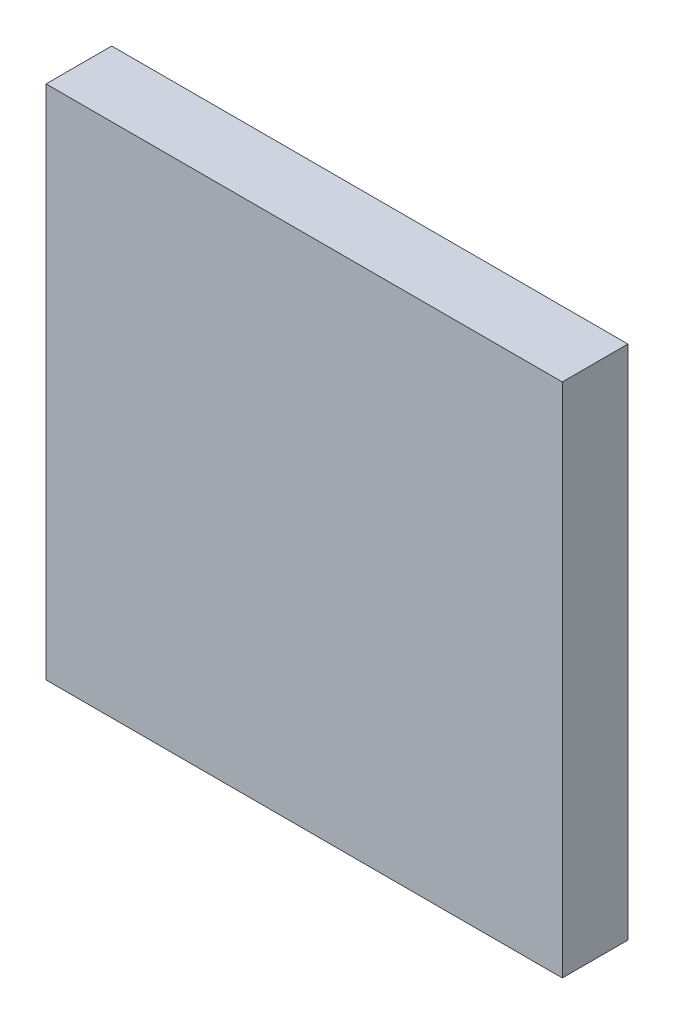
ISO-10303-21;
HEADER;
FILE_DESCRIPTION(('STEP AP214'),'2;1');
FILE_NAME('part.step','',(''),(''),'','','');
FILE_SCHEMA(('AUTOMOTIVE_DESIGN { 1 0 10303 214 1 1 1 1 }'));
ENDSEC;
DATA;
#1=APPLICATION_CONTEXT('core data for automotive mechanical design processes');
#2=APPLICATION_PROTOCOL_DEFINITION('international standard','automotive_design',2000,#1);
#3=PRODUCT_CONTEXT('',#1,'mechanical');
#4=PRODUCT('Part','Part','',(#3));
#5=PRODUCT_RELATED_PRODUCT_CATEGORY('part','',(#4));
#6=PRODUCT_DEFINITION_FORMATION('','',#4);
#7=PRODUCT_DEFINITION_CONTEXT('part definition',#1,'design');
#8=PRODUCT_DEFINITION('design','',#6,#7);
#9=PRODUCT_DEFINITION_SHAPE('','',#8);
#10=(LENGTH_UNIT() NAMED_UNIT(*) SI_UNIT(.MILLI.,.METRE.));
#11=(NAMED_UNIT(*) PLANE_ANGLE_UNIT() SI_UNIT($,.RADIAN.));
#12=(NAMED_UNIT(*) SI_UNIT($,.STERADIAN.) SOLID_ANGLE_UNIT());
#13=UNCERTAINTY_MEASURE_WITH_UNIT(LENGTH_MEASURE(1.E-05),#10,'distance_accuracy_value','');
#14=(GEOMETRIC_REPRESENTATION_CONTEXT(3) GLOBAL_UNCERTAINTY_ASSIGNED_CONTEXT((#13)) GLOBAL_UNIT_ASSIGNED_CONTEXT((#10,
#11,#12)) REPRESENTATION_CONTEXT('',''));
#15=CARTESIAN_POINT('',(0.,0.,0.));
#16=DIRECTION('',(0.,0.,1.));
#17=DIRECTION('',(1.,0.,0.));
#18=AXIS2_PLACEMENT_3D('',#15,#16,#17);
#19=CARTESIAN_POINT('',(0.,0.,0.89000076));
#20=DIRECTION('',(0.,0.,1.));
#21=DIRECTION('',(1.,0.,0.));
#22=AXIS2_PLACEMENT_3D('',#19,#20,#21);
#23=PLANE('',#22);
#24=DIRECTION('',(0.,1.,0.));
#25=VECTOR('',#24,1.);
#26=CARTESIAN_POINT('',(-3.50000062,3.50000062,0.89000076));
#27=LINE('',#26,#25);
#28=CARTESIAN_POINT('',(-3.50000062,3.50000062,0.89000076));
#29=VERTEX_POINT('',#28);
#30=CARTESIAN_POINT('',(-3.50000062,-3.50000062,0.89000076));
#31=VERTEX_POINT('',#30);
#32=EDGE_CURVE('E76',#29,#31,#27,.F.);
#33=ORIENTED_EDGE('',*,*,#32,.T.);
#34=DIRECTION('',(1.,0.,0.));
#35=VECTOR('',#34,1.);
#36=CARTESIAN_POINT('',(-3.50000062,-3.50000062,0.89000076));
#37=LINE('',#36,#35);
#38=CARTESIAN_POINT('',(3.50000062,-3.50000062,0.89000076));
#39=VERTEX_POINT('',#38);
#40=EDGE_CURVE('E58',#31,#39,#37,.T.);
#41=ORIENTED_EDGE('',*,*,#40,.T.);
#42=DIRECTION('',(0.,1.,0.));
#43=VECTOR('',#42,1.);
#44=CARTESIAN_POINT('',(3.50000062,-3.50000062,0.89000076));
#45=LINE('',#44,#43);
#46=CARTESIAN_POINT('',(3.50000062,3.50000062,0.89000076));
#47=VERTEX_POINT('',#46);
#48=EDGE_CURVE('E20',#39,#47,#45,.T.);
#49=ORIENTED_EDGE('',*,*,#48,.T.);
#50=DIRECTION('',(1.,0.,0.));
#51=VECTOR('',#50,1.);
#52=CARTESIAN_POINT('',(3.50000062,3.50000062,0.89000076));
#53=LINE('',#52,#51);
#54=EDGE_CURVE('E55',#47,#29,#53,.F.);
#55=ORIENTED_EDGE('',*,*,#54,.T.);
#56=EDGE_LOOP('',(#33,#41,#49,#55));
#57=FACE_BOUND('',#56,.T.);
#58=ADVANCED_FACE('F17',(#57),#23,.T.);
#59=CARTESIAN_POINT('',(3.50000062,-3.50000062,0.));
#60=DIRECTION('',(-1.,0.,0.));
#61=DIRECTION('',(0.,0.,1.));
#62=AXIS2_PLACEMENT_3D('',#59,#60,#61);
#63=PLANE('',#62);
#64=DIRECTION('',(0.,0.,-1.));
#65=VECTOR('',#64,1.);
#66=CARTESIAN_POINT('',(3.50000062,3.50000062,0.));
#67=LINE('',#66,#65);
#68=CARTESIAN_POINT('',(3.50000062,3.50000062,0.));
#69=VERTEX_POINT('',#68);
#70=EDGE_CURVE('E63',#69,#47,#67,.F.);
#71=ORIENTED_EDGE('',*,*,#70,.T.);
#72=ORIENTED_EDGE('',*,*,#48,.F.);
#73=DIRECTION('',(0.,0.,1.));
#74=VECTOR('',#73,1.);
#75=CARTESIAN_POINT('',(3.50000062,-3.50000062,0.));
#76=LINE('',#75,#74);
#77=CARTESIAN_POINT('',(3.50000062,-3.50000062,0.));
#78=VERTEX_POINT('',#77);
#79=EDGE_CURVE('E80',#39,#78,#76,.F.);
#80=ORIENTED_EDGE('',*,*,#79,.T.);
#81=DIRECTION('',(0.,1.,0.));
#82=VECTOR('',#81,1.);
#83=CARTESIAN_POINT('',(3.50000062,0.,0.));
#84=LINE('',#83,#82);
#85=EDGE_CURVE('E73',#78,#69,#84,.T.);
#86=ORIENTED_EDGE('',*,*,#85,.T.);
#87=EDGE_LOOP('',(#71,#72,#80,#86));
#88=FACE_BOUND('',#87,.T.);
#89=ADVANCED_FACE('F72',(#88),#63,.F.);
#90=CARTESIAN_POINT('',(3.50000062,3.50000062,0.));
#91=DIRECTION('',(0.,-1.,0.));
#92=DIRECTION('',(0.,0.,-1.));
#93=AXIS2_PLACEMENT_3D('',#90,#91,#92);
#94=PLANE('',#93);
#95=DIRECTION('',(0.,0.,-1.));
#96=VECTOR('',#95,1.);
#97=CARTESIAN_POINT('',(-3.50000062,3.50000062,0.));
#98=LINE('',#97,#96);
#99=CARTESIAN_POINT('',(-3.50000062,3.50000062,0.));
#100=VERTEX_POINT('',#99);
#101=EDGE_CURVE('E69',#100,#29,#98,.F.);
#102=ORIENTED_EDGE('',*,*,#101,.T.);
#103=ORIENTED_EDGE('',*,*,#54,.F.);
#104=ORIENTED_EDGE('',*,*,#70,.F.);
#105=DIRECTION('',(1.,0.,0.));
#106=VECTOR('',#105,1.);
#107=CARTESIAN_POINT('',(0.,3.50000062,0.));
#108=LINE('',#107,#106);
#109=EDGE_CURVE('E83',#69,#100,#108,.F.);
#110=ORIENTED_EDGE('',*,*,#109,.T.);
#111=EDGE_LOOP('',(#102,#103,#104,#110));
#112=FACE_BOUND('',#111,.T.);
#113=ADVANCED_FACE('F66',(#112),#94,.F.);
#114=CARTESIAN_POINT('',(-3.50000062,3.50000062,0.));
#115=DIRECTION('',(1.,0.,0.));
#116=DIRECTION('',(0.,0.,-1.));
#117=AXIS2_PLACEMENT_3D('',#114,#115,#116);
#118=PLANE('',#117);
#119=DIRECTION('',(0.,0.,1.));
#120=VECTOR('',#119,1.);
#121=CARTESIAN_POINT('',(-3.50000062,-3.50000062,0.));
#122=LINE('',#121,#120);
#123=CARTESIAN_POINT('',(-3.50000062,-3.50000062,0.));
#124=VERTEX_POINT('',#123);
#125=EDGE_CURVE('E34',#124,#31,#122,.T.);
#126=ORIENTED_EDGE('',*,*,#125,.T.);
#127=ORIENTED_EDGE('',*,*,#32,.F.);
#128=ORIENTED_EDGE('',*,*,#101,.F.);
#129=DIRECTION('',(0.,1.,0.));
#130=VECTOR('',#129,1.);
#131=CARTESIAN_POINT('',(-3.50000062,0.,0.));
#132=LINE('',#131,#130);
#133=EDGE_CURVE('E26',#100,#124,#132,.F.);
#134=ORIENTED_EDGE('',*,*,#133,.T.);
#135=EDGE_LOOP('',(#126,#127,#128,#134));
#136=FACE_BOUND('',#135,.T.);
#137=ADVANCED_FACE('F88',(#136),#118,.F.);
#138=CARTESIAN_POINT('',(-3.50000062,-3.50000062,0.));
#139=DIRECTION('',(0.,1.,0.));
#140=DIRECTION('',(0.,0.,1.));
#141=AXIS2_PLACEMENT_3D('',#138,#139,#140);
#142=PLANE('',#141);
#143=ORIENTED_EDGE('',*,*,#79,.F.);
#144=ORIENTED_EDGE('',*,*,#40,.F.);
#145=ORIENTED_EDGE('',*,*,#125,.F.);
#146=DIRECTION('',(1.,0.,0.));
#147=VECTOR('',#146,1.);
#148=CARTESIAN_POINT('',(0.,-3.50000062,0.));
#149=LINE('',#148,#147);
#150=EDGE_CURVE('E11',#124,#78,#149,.T.);
#151=ORIENTED_EDGE('',*,*,#150,.T.);
#152=EDGE_LOOP('',(#143,#144,#145,#151));
#153=FACE_BOUND('',#152,.T.);
#154=ADVANCED_FACE('F91',(#153),#142,.F.);
#155=CARTESIAN_POINT('',(0.,0.,0.));
#156=DIRECTION('',(0.,0.,1.));
#157=DIRECTION('',(1.,0.,0.));
#158=AXIS2_PLACEMENT_3D('',#155,#156,#157);
#159=PLANE('',#158);
#160=ORIENTED_EDGE('',*,*,#133,.F.);
#161=ORIENTED_EDGE('',*,*,#109,.F.);
#162=ORIENTED_EDGE('',*,*,#85,.F.);
#163=ORIENTED_EDGE('',*,*,#150,.F.);
#164=EDGE_LOOP('',(#160,#161,#162,#163));
#165=FACE_BOUND('',#164,.T.);
#166=ADVANCED_FACE('F90',(#165),#159,.F.);
#167=CLOSED_SHELL('',(#58,#89,#113,#137,#154,#166));
#168=MANIFOLD_SOLID_BREP('B1',#167);
#169=ADVANCED_BREP_SHAPE_REPRESENTATION('',(#18,#168),#14);
#170=SHAPE_DEFINITION_REPRESENTATION(#9,#169);
ENDSEC;
END-ISO-10303-21;
